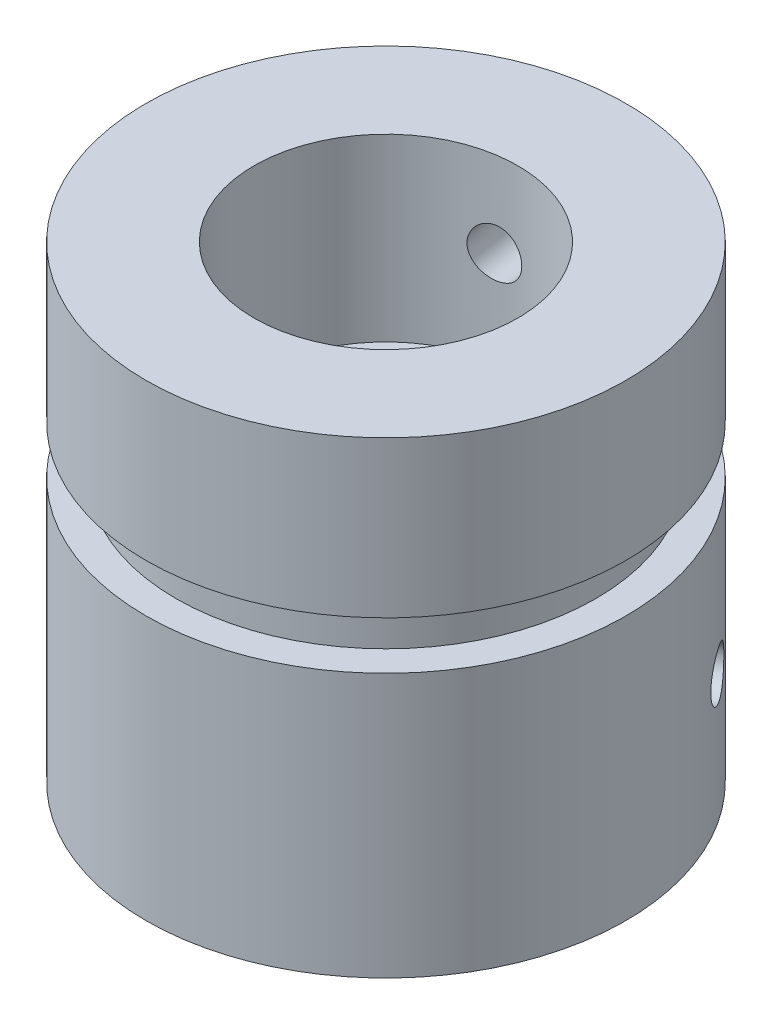
ISO-10303-21;
HEADER;
FILE_DESCRIPTION(('STEP AP214'),'2;1');
FILE_NAME('part.step','',(''),(''),'','','');
FILE_SCHEMA(('AUTOMOTIVE_DESIGN { 1 0 10303 214 1 1 1 1 }'));
ENDSEC;
DATA;
#1=APPLICATION_CONTEXT('core data for automotive mechanical design processes');
#2=APPLICATION_PROTOCOL_DEFINITION('international standard','automotive_design',2000,#1);
#3=PRODUCT_CONTEXT('',#1,'mechanical');
#4=PRODUCT('Part','Part','',(#3));
#5=PRODUCT_RELATED_PRODUCT_CATEGORY('part','',(#4));
#6=PRODUCT_DEFINITION_FORMATION('','',#4);
#7=PRODUCT_DEFINITION_CONTEXT('part definition',#1,'design');
#8=PRODUCT_DEFINITION('design','',#6,#7);
#9=PRODUCT_DEFINITION_SHAPE('','',#8);
#10=(LENGTH_UNIT() NAMED_UNIT(*) SI_UNIT(.MILLI.,.METRE.));
#11=(NAMED_UNIT(*) PLANE_ANGLE_UNIT() SI_UNIT($,.RADIAN.));
#12=(NAMED_UNIT(*) SI_UNIT($,.STERADIAN.) SOLID_ANGLE_UNIT());
#13=UNCERTAINTY_MEASURE_WITH_UNIT(LENGTH_MEASURE(1.E-05),#10,'distance_accuracy_value','');
#14=(GEOMETRIC_REPRESENTATION_CONTEXT(3) GLOBAL_UNCERTAINTY_ASSIGNED_CONTEXT((#13)) GLOBAL_UNIT_ASSIGNED_CONTEXT((#10,
#11,#12)) REPRESENTATION_CONTEXT('',''));
#15=CARTESIAN_POINT('',(0.,0.,0.));
#16=DIRECTION('',(0.,0.,1.));
#17=DIRECTION('',(1.,0.,0.));
#18=AXIS2_PLACEMENT_3D('',#15,#16,#17);
#19=CARTESIAN_POINT('',(0.,24.,0.));
#20=DIRECTION('',(0.,1.,0.));
#21=DIRECTION('',(0.,0.,1.));
#22=AXIS2_PLACEMENT_3D('',#19,#20,#21);
#23=PLANE('',#22);
#24=CARTESIAN_POINT('',(0.,24.,0.));
#25=DIRECTION('',(0.,1.,0.));
#26=DIRECTION('',(0.,0.,1.));
#27=AXIS2_PLACEMENT_3D('',#24,#25,#26);
#28=CIRCLE('',#27,4.);
#29=CARTESIAN_POINT('',(0.,24.,4.));
#30=VERTEX_POINT('',#29);
#31=EDGE_CURVE('E57',#30,#30,#28,.T.);
#32=ORIENTED_EDGE('',*,*,#31,.F.);
#33=EDGE_LOOP('',(#32));
#34=FACE_BOUND('',#33,.T.);
#35=CARTESIAN_POINT('',(0.,24.,0.));
#36=DIRECTION('',(0.,1.,0.));
#37=DIRECTION('',(0.,0.,1.));
#38=AXIS2_PLACEMENT_3D('',#35,#36,#37);
#39=CIRCLE('',#38,11.);
#40=CARTESIAN_POINT('',(0.,24.,11.));
#41=VERTEX_POINT('',#40);
#42=EDGE_CURVE('E10',#41,#41,#39,.F.);
#43=ORIENTED_EDGE('',*,*,#42,.F.);
#44=EDGE_LOOP('',(#43));
#45=FACE_BOUND('',#44,.T.);
#46=ADVANCED_FACE('F33',(#34,#45),#23,.T.);
#47=CARTESIAN_POINT('',(0.,22.,0.));
#48=DIRECTION('',(0.,1.,0.));
#49=DIRECTION('',(0.,0.,1.));
#50=AXIS2_PLACEMENT_3D('',#47,#48,#49);
#51=PLANE('',#50);
#52=CARTESIAN_POINT('',(0.,22.,0.));
#53=DIRECTION('',(0.,1.,0.));
#54=DIRECTION('',(0.,0.,1.));
#55=AXIS2_PLACEMENT_3D('',#52,#53,#54);
#56=CIRCLE('',#55,20.);
#57=CARTESIAN_POINT('',(0.,22.,20.));
#58=VERTEX_POINT('',#57);
#59=EDGE_CURVE('E41',#58,#58,#56,.T.);
#60=ORIENTED_EDGE('',*,*,#59,.T.);
#61=EDGE_LOOP('',(#60));
#62=FACE_BOUND('',#61,.T.);
#63=CARTESIAN_POINT('',(0.,22.,0.));
#64=DIRECTION('',(0.,1.,0.));
#65=DIRECTION('',(0.,0.,1.));
#66=AXIS2_PLACEMENT_3D('',#63,#64,#65);
#67=CIRCLE('',#66,17.5);
#68=CARTESIAN_POINT('',(0.,22.,17.5));
#69=VERTEX_POINT('',#68);
#70=EDGE_CURVE('E54',#69,#69,#67,.T.);
#71=ORIENTED_EDGE('',*,*,#70,.F.);
#72=EDGE_LOOP('',(#71));
#73=FACE_BOUND('',#72,.T.);
#74=ADVANCED_FACE('F126',(#62,#73),#51,.T.);
#75=CARTESIAN_POINT('',(0.,0.,0.));
#76=DIRECTION('',(0.,1.,0.));
#77=DIRECTION('',(0.,0.,1.));
#78=AXIS2_PLACEMENT_3D('',#75,#76,#77);
#79=PLANE('',#78);
#80=CARTESIAN_POINT('',(0.,0.,0.));
#81=DIRECTION('',(0.,1.,0.));
#82=DIRECTION('',(0.,0.,1.));
#83=AXIS2_PLACEMENT_3D('',#80,#81,#82);
#84=CIRCLE('',#83,20.);
#85=CARTESIAN_POINT('',(0.,0.,20.));
#86=VERTEX_POINT('',#85);
#87=EDGE_CURVE('E45',#86,#86,#84,.T.);
#88=ORIENTED_EDGE('',*,*,#87,.F.);
#89=EDGE_LOOP('',(#88));
#90=FACE_BOUND('',#89,.T.);
#91=CARTESIAN_POINT('',(0.,0.,0.));
#92=DIRECTION('',(0.,1.,0.));
#93=DIRECTION('',(0.,0.,1.));
#94=AXIS2_PLACEMENT_3D('',#91,#92,#93);
#95=CIRCLE('',#94,4.);
#96=CARTESIAN_POINT('',(0.,0.,4.));
#97=VERTEX_POINT('',#96);
#98=EDGE_CURVE('E50',#97,#97,#95,.T.);
#99=ORIENTED_EDGE('',*,*,#98,.T.);
#100=EDGE_LOOP('',(#99));
#101=FACE_BOUND('',#100,.T.);
#102=ADVANCED_FACE('F131',(#90,#101),#79,.F.);
#103=CARTESIAN_POINT('',(0.,22.,0.));
#104=DIRECTION('',(0.,-1.,0.));
#105=DIRECTION('',(0.,0.,-1.));
#106=AXIS2_PLACEMENT_3D('',#103,#104,#105);
#107=CYLINDRICAL_SURFACE('',#106,20.);
#108=CARTESIAN_POINT('',(15.3909682439954,10.5325818987797,-12.7717695137489));
#109=CARTESIAN_POINT('',(15.3909720440554,10.4205427704325,-12.7717662214388));
#110=CARTESIAN_POINT('',(15.3970367361014,10.3084295619561,-12.7644674356539));
#111=CARTESIAN_POINT('',(15.4210728520109,10.0873115261927,-12.735417299528));
#112=CARTESIAN_POINT('',(15.4390573975688,9.97831026270477,-12.7136500218069));
#113=CARTESIAN_POINT('',(15.486209502926,9.76665026034394,-12.6561719551576));
#114=CARTESIAN_POINT('',(15.5153702829427,9.66398771999687,-12.6204696193423));
#115=CARTESIAN_POINT('',(15.5837372149178,9.46784631419625,-12.5359512875308));
#116=CARTESIAN_POINT('',(15.6229413717032,9.37436562981231,-12.4871378960261));
#117=CARTESIAN_POINT('',(15.7100681150233,9.19887937146475,-12.3773451362583));
#118=CARTESIAN_POINT('',(15.7580184827791,9.11691187977218,-12.3163269395689));
#119=CARTESIAN_POINT('',(15.8608105723585,8.96710668077261,-12.1836659010681));
#120=CARTESIAN_POINT('',(15.9156526093087,8.89926961996713,-12.112022573388));
#121=CARTESIAN_POINT('',(16.0304290497222,8.77951938476544,-11.959700809368));
#122=CARTESIAN_POINT('',(16.090373890753,8.72763990119242,-11.8790037413824));
#123=CARTESIAN_POINT('',(16.2132334405108,8.64149303248239,-11.7107600003479));
#124=CARTESIAN_POINT('',(16.2761480768048,8.60722521804081,-11.6232134943218));
#125=CARTESIAN_POINT('',(16.4027076924813,8.55738608007325,-11.4439143240344));
#126=CARTESIAN_POINT('',(16.4663495020127,8.54175223327986,-11.3521768041806));
#127=CARTESIAN_POINT('',(16.5926434767783,8.52943136051232,-11.1667704009719));
#128=CARTESIAN_POINT('',(16.6552956676296,8.5327438432872,-11.0731015677559));
#129=CARTESIAN_POINT('',(16.7776222718003,8.55817084408006,-10.8868619609348));
#130=CARTESIAN_POINT('',(16.8373065262552,8.58021812990753,-10.7942884595369));
#131=CARTESIAN_POINT('',(16.9524009420536,8.64238415667299,-10.6126185848684));
#132=CARTESIAN_POINT('',(17.0078110478666,8.6825031323549,-10.5235222567812));
#133=CARTESIAN_POINT('',(17.1131573002131,8.77974742528863,-10.3513314926881));
#134=CARTESIAN_POINT('',(17.1630836596246,8.83690249384007,-10.2682478751817));
#135=CARTESIAN_POINT('',(17.2563034964411,8.96657494545249,-10.1108047967914));
#136=CARTESIAN_POINT('',(17.2995967792482,9.03909277907012,-10.0364455918752));
#137=CARTESIAN_POINT('',(17.3789075783219,9.19781035780704,-9.8984819417368));
#138=CARTESIAN_POINT('',(17.4148924256431,9.2840685882629,-9.83492598499151));
#139=CARTESIAN_POINT('',(17.4787269691803,9.4676156292013,-9.72102772585464));
#140=CARTESIAN_POINT('',(17.5065766535958,9.56490445568404,-9.67068544263021));
#141=CARTESIAN_POINT('',(17.5537023690329,9.76779594917933,-9.58488089182741));
#142=CARTESIAN_POINT('',(17.5729765923218,9.87340036362553,-9.54942176175102));
#143=CARTESIAN_POINT('',(17.6026510365328,10.0899031080091,-9.49461197421014));
#144=CARTESIAN_POINT('',(17.6130515278082,10.2008012765546,-9.47526082598913));
#145=CARTESIAN_POINT('',(17.6248017307765,10.4242302578388,-9.45338671427985));
#146=CARTESIAN_POINT('',(17.6261903775458,10.5367519393094,-9.45079135875285));
#147=CARTESIAN_POINT('',(17.6200005656033,10.7606844304255,-9.46232641761045));
#148=CARTESIAN_POINT('',(17.6124222280551,10.8720952550605,-9.47645660599626));
#149=CARTESIAN_POINT('',(17.5884334838443,11.0904050633364,-9.52090524200923));
#150=CARTESIAN_POINT('',(17.5720416808486,11.1973130409691,-9.55118958999953));
#151=CARTESIAN_POINT('',(17.5306792079806,11.4038620022404,-9.62689650367785));
#152=CARTESIAN_POINT('',(17.5057083415963,11.5035028193541,-9.672319416129));
#153=CARTESIAN_POINT('',(17.4474732529364,11.6930618468373,-9.77697610758962));
#154=CARTESIAN_POINT('',(17.4141810705344,11.7829457827123,-9.83625640385307));
#155=CARTESIAN_POINT('',(17.3399005886404,11.9500920053279,-9.96661732789417));
#156=CARTESIAN_POINT('',(17.2989120985876,12.0273539794599,-10.0376982478505));
#157=CARTESIAN_POINT('',(17.2098267151827,12.1673451655759,-10.1896828351251));
#158=CARTESIAN_POINT('',(17.161704744571,12.2300210179522,-10.2706209680223));
#159=CARTESIAN_POINT('',(17.0594479954067,12.3386936357926,-10.4395867844772));
#160=CARTESIAN_POINT('',(17.0053132992551,12.384690629794,-10.5276143708734));
#161=CARTESIAN_POINT('',(16.8923688031295,12.4586094340904,-10.7079018261933));
#162=CARTESIAN_POINT('',(16.8335675509829,12.4865634734302,-10.8001538317355));
#163=CARTESIAN_POINT('',(16.7126914471745,12.5237080379394,-10.9862755964545));
#164=CARTESIAN_POINT('',(16.6506166875659,12.5328990904478,-11.0801453100904));
#165=CARTESIAN_POINT('',(16.5251835775492,12.5322493658999,-11.2663594948866));
#166=CARTESIAN_POINT('',(16.4618320067146,12.5224914251064,-11.3587088328791));
#167=CARTESIAN_POINT('',(16.3354527443843,12.4843944074658,-11.5397215272106));
#168=CARTESIAN_POINT('',(16.272425053143,12.4560553160338,-11.6283848806564));
#169=CARTESIAN_POINT('',(16.1486754069908,12.3816233839939,-11.7996377621411));
#170=CARTESIAN_POINT('',(16.087953138829,12.3355329649114,-11.8822281167914));
#171=CARTESIAN_POINT('',(15.9707994212634,12.2269155609458,-12.0392347209294));
#172=CARTESIAN_POINT('',(15.9143679467552,12.1643886722375,-12.1136510182425));
#173=CARTESIAN_POINT('',(15.8075025711246,12.0243626607322,-12.2527793953078));
#174=CARTESIAN_POINT('',(15.7570948065452,11.9468018662901,-12.3174494823999));
#175=CARTESIAN_POINT('',(15.6643523223836,11.7790311956888,-12.435179879603));
#176=CARTESIAN_POINT('',(15.6220195430919,11.6888182884416,-12.4882373998493));
#177=CARTESIAN_POINT('',(15.5469267256583,11.4980532149399,-12.5816008241834));
#178=CARTESIAN_POINT('',(15.5141913079383,11.3974753361316,-12.6218739535638));
#179=CARTESIAN_POINT('',(15.4597393546928,11.1890853162873,-12.688511649414));
#180=CARTESIAN_POINT('',(15.438010391247,11.0812814909283,-12.7148919043431));
#181=CARTESIAN_POINT('',(15.411846131617,10.8994864169815,-12.7465778645495));
#182=CARTESIAN_POINT('',(15.4040310248944,10.8266573961669,-12.7560141114727));
#183=CARTESIAN_POINT('',(15.3935908409349,10.6800902526946,-12.768611006783));
#184=CARTESIAN_POINT('',(15.3909657419113,10.6063521338546,-12.7717716815138));
#185=CARTESIAN_POINT('',(15.3909682439954,10.5325818987797,-12.7717695137489));
#186=B_SPLINE_CURVE_WITH_KNOTS('',3,(#108,#109,#110,#111,#112,#113,#114,#115,#116,#117,#118,
#119,#120,#121,#122,#123,#124,#125,#126,#127,#128,#129,#130,#131,#132,#133,#134,#135,#136,#137,
#138,#139,#140,#141,#142,#143,#144,#145,#146,#147,#148,#149,#150,#151,#152,#153,#154,#155,#156,
#157,#158,#159,#160,#161,#162,#163,#164,#165,#166,#167,#168,#169,#170,#171,#172,#173,#174,#175,
#176,#177,#178,#179,#180,#181,#182,#183,#184,#185),.UNSPECIFIED.,.T.,.F.,(4,2,2,2,2,2,2,2,2,2,2,
2,2,2,2,2,2,2,2,2,2,2,2,2,2,2,2,2,2,2,2,2,2,2,2,2,2,2,4),(0.,0.335847988872925,
0.672066303643539,1.00808098199495,1.34402896084263,1.6810632305985,2.01811291710505,
2.35586939942583,2.69361764815589,3.03022941796899,3.36683245996464,3.70223263637322,
4.03763716961948,4.37363090932826,4.70963450437057,5.04710850170002,5.38458298855125,
5.72212858235866,6.05966389190065,6.39573992615529,6.73181141933739,7.06717629409053,
7.40254885122093,7.73906379623434,8.07558707446403,8.41332273636235,8.75105377036008,
9.08817985388721,9.42529646226297,9.76094266936964,10.0965891399331,10.4321898399049,
10.767788576216,11.1047943007597,11.4418809006905,11.7798248214095,12.11738629788,
12.3385205521209,12.5596538780763),.UNSPECIFIED.);
#187=CARTESIAN_POINT('',(15.3909682439954,10.5325818987797,-12.7717695137489));
#188=VERTEX_POINT('',#187);
#189=EDGE_CURVE('E72',#188,#188,#186,.T.);
#190=ORIENTED_EDGE('',*,*,#189,.T.);
#191=EDGE_LOOP('',(#190));
#192=FACE_BOUND('',#191,.T.);
#193=ORIENTED_EDGE('',*,*,#59,.F.);
#194=EDGE_LOOP('',(#193));
#195=FACE_BOUND('',#194,.T.);
#196=ORIENTED_EDGE('',*,*,#87,.T.);
#197=EDGE_LOOP('',(#196));
#198=FACE_BOUND('',#197,.T.);
#199=ADVANCED_FACE('F35',(#192,#195,#198),#107,.T.);
#200=CARTESIAN_POINT('',(0.,22.,0.));
#201=DIRECTION('',(0.,-1.,0.));
#202=DIRECTION('',(0.,0.,-1.));
#203=AXIS2_PLACEMENT_3D('',#200,#201,#202);
#204=CYLINDRICAL_SURFACE('',#203,4.);
#205=CARTESIAN_POINT('',(1.7567796359188,10.5325818987797,-3.59356721250918));
#206=CARTESIAN_POINT('',(1.75679283000752,10.4283686933054,-3.59356595339015));
#207=CARTESIAN_POINT('',(1.76531985553889,10.3240197222459,-3.58943096168029));
#208=CARTESIAN_POINT('',(1.79862617347518,10.1185267215491,-3.57285139835941));
#209=CARTESIAN_POINT('',(1.82343961618114,10.017389895532,-3.56038936513382));
#210=CARTESIAN_POINT('',(1.8869504065891,9.82167874233282,-3.52713531205447));
#211=CARTESIAN_POINT('',(1.92557389770552,9.7270726399305,-3.5063875368974));
#212=CARTESIAN_POINT('',(2.01399877991732,9.5457334483036,-3.45635381381173));
#213=CARTESIAN_POINT('',(2.06380077570492,9.45900078534298,-3.42706740396694));
#214=CARTESIAN_POINT('',(2.17632464995243,9.28797045564637,-3.35683727604843));
#215=CARTESIAN_POINT('',(2.23977335021337,9.20446363118798,-3.31513131113604));
#216=CARTESIAN_POINT('',(2.37334515638611,9.04976511820915,-3.22085657495544));
#217=CARTESIAN_POINT('',(2.44347156467837,8.97857957257578,-3.1682824137449));
#218=CARTESIAN_POINT('',(2.59212828728661,8.84584759759125,-3.04804858417364));
#219=CARTESIAN_POINT('',(2.67090644979579,8.78527436335644,-2.97961092628618));
#220=CARTESIAN_POINT('',(2.82860313721322,8.68230019199266,-2.8303283455945));
#221=CARTESIAN_POINT('',(2.90752154184393,8.63988778642895,-2.74949129685945));
#222=CARTESIAN_POINT('',(3.05609829547676,8.57757257624858,-2.58298523898507));
#223=CARTESIAN_POINT('',(3.12601597832476,8.55628284608765,-2.49806931913882));
#224=CARTESIAN_POINT('',(3.25961091031649,8.53224966141072,-2.32103529392694));
#225=CARTESIAN_POINT('',(3.32329191232474,8.52949498518347,-2.22892158051752));
#226=CARTESIAN_POINT('',(3.43693517314072,8.54207524672489,-2.04886039714592));
#227=CARTESIAN_POINT('',(3.4876088573941,8.55585792982339,-1.96124720701138));
#228=CARTESIAN_POINT('',(3.58084507161119,8.59834358658788,-1.78534578591609));
#229=CARTESIAN_POINT('',(3.62340699429546,8.62704767673188,-1.69705750492953));
#230=CARTESIAN_POINT('',(3.7006893652808,8.69874703095971,-1.52126729748173));
#231=CARTESIAN_POINT('',(3.7352931762089,8.74193452512397,-1.43379315065212));
#232=CARTESIAN_POINT('',(3.79632361836388,8.84110873118265,-1.26338101295286));
#233=CARTESIAN_POINT('',(3.82274731404949,8.89710002538443,-1.18044465929919));
#234=CARTESIAN_POINT('',(3.87044186043689,9.02637260184581,-1.01384366327234));
#235=CARTESIAN_POINT('',(3.89098951909004,9.10078795543178,-0.930851249505833));
#236=CARTESIAN_POINT('',(3.9248517512014,9.2617613486401,-0.775790268096948));
#237=CARTESIAN_POINT('',(3.93816077361105,9.34832864332787,-0.703730114457341));
#238=CARTESIAN_POINT('',(3.95989152358749,9.53787828362793,-0.569371600112251));
#239=CARTESIAN_POINT('',(3.96794921727975,9.64155394488817,-0.507983750695575));
#240=CARTESIAN_POINT('',(3.97980498733877,9.85845724149775,-0.404815813618186));
#241=CARTESIAN_POINT('',(3.98360751359104,9.97167476481487,-0.363015268979284));
#242=CARTESIAN_POINT('',(3.98846229202149,10.1950109213453,-0.304896954869585));
#243=CARTESIAN_POINT('',(3.98970861201341,10.3046641368668,-0.286822288964343));
#244=CARTESIAN_POINT('',(3.99075844484332,10.5253845818128,-0.271877571616975));
#245=CARTESIAN_POINT('',(3.99056297684754,10.6364507570193,-0.274992541595269));
#246=CARTESIAN_POINT('',(3.98870503184918,10.8438897359372,-0.300586049638195));
#247=CARTESIAN_POINT('',(3.98720537147342,10.9405408009955,-0.320909112702919));
#248=CARTESIAN_POINT('',(3.98232303936164,11.1293174713217,-0.376670210613729));
#249=CARTESIAN_POINT('',(3.97893975771962,11.2214416002732,-0.412113140318359));
#250=CARTESIAN_POINT('',(3.96911286457871,11.4034045605849,-0.498085938542994));
#251=CARTESIAN_POINT('',(3.96253477071397,11.4929399324858,-0.549238533301799));
#252=CARTESIAN_POINT('',(3.94500301391803,11.6635204418588,-0.663545941842856));
#253=CARTESIAN_POINT('',(3.9340471006864,11.7445611858103,-0.726706919445627));
#254=CARTESIAN_POINT('',(3.9047165932706,11.9065394338224,-0.871372560357581));
#255=CARTESIAN_POINT('',(3.88558092579545,11.9861762001975,-0.954185917386525));
#256=CARTESIAN_POINT('',(3.83839268652889,12.1314063747845,-1.12913634310326));
#257=CARTESIAN_POINT('',(3.81033711062939,12.1969950393066,-1.2212765458139));
#258=CARTESIAN_POINT('',(3.74307560061328,12.3137293506125,-1.41424288728613));
#259=CARTESIAN_POINT('',(3.70359492943881,12.3644481349465,-1.51523408558475));
#260=CARTESIAN_POINT('',(3.61314083432289,12.4468577067494,-1.7197895369481));
#261=CARTESIAN_POINT('',(3.56217755633909,12.4785652024638,-1.82335144709799));
#262=CARTESIAN_POINT('',(3.45450223495221,12.5193190262649,-2.01934523965697));
#263=CARTESIAN_POINT('',(3.39874669465457,12.530177647444,-2.11192648967358));
#264=CARTESIAN_POINT('',(3.27966738878581,12.5342684327754,-2.29247873024106));
#265=CARTESIAN_POINT('',(3.21634627998193,12.5275067673086,-2.3804513236739));
#266=CARTESIAN_POINT('',(3.08879206841373,12.4977490744633,-2.5434980028843));
#267=CARTESIAN_POINT('',(3.02489400640891,12.4758521614707,-2.61904004484648));
#268=CARTESIAN_POINT('',(2.89473174963625,12.4179279389731,-2.76222661929293));
#269=CARTESIAN_POINT('',(2.82846721678807,12.3818986030728,-2.82987001741442));
#270=CARTESIAN_POINT('',(2.69307699738843,12.2951276437883,-2.95913381305014));
#271=CARTESIAN_POINT('',(2.62395015625195,12.2438226790279,-3.02037286419849));
#272=CARTESIAN_POINT('',(2.48825445740932,12.1286666106617,-3.13311102718751));
#273=CARTESIAN_POINT('',(2.42168679142436,12.0648097446782,-3.18460564412259));
#274=CARTESIAN_POINT('',(2.28729782026869,11.9189852632203,-3.28266006753445));
#275=CARTESIAN_POINT('',(2.22001105684953,11.8358477179795,-3.32821874405798));
#276=CARTESIAN_POINT('',(2.09510341988577,11.6576896704737,-3.40823336884813));
#277=CARTESIAN_POINT('',(2.03749111124136,11.5626587674192,-3.44267950364957));
#278=CARTESIAN_POINT('',(1.93412528282244,11.3592730046495,-3.5018340275786));
#279=CARTESIAN_POINT('',(1.88880405960264,11.2505919880445,-3.52620028474973));
#280=CARTESIAN_POINT('',(1.83479822602958,11.0820037791488,-3.55442239752045));
#281=CARTESIAN_POINT('',(1.81913348903191,11.0249340781891,-3.56243839020892));
#282=CARTESIAN_POINT('',(1.7928366822121,10.9093493412796,-3.57574565623739));
#283=CARTESIAN_POINT('',(1.78220109392315,10.8508353460255,-3.5810388347269));
#284=CARTESIAN_POINT('',(1.76845618150436,10.7489811095325,-3.58784108783401));
#285=CARTESIAN_POINT('',(1.76408593814497,10.7058488415297,-3.58998816020092));
#286=CARTESIAN_POINT('',(1.75824482139097,10.6193462056868,-3.5928515325421));
#287=CARTESIAN_POINT('',(1.75677414195791,10.575975822113,-3.59356773680084));
#288=CARTESIAN_POINT('',(1.7567796359188,10.5325818987797,-3.59356721250918));
#289=B_SPLINE_CURVE_WITH_KNOTS('',3,(#205,#206,#207,#208,#209,#210,#211,#212,#213,#214,#215,
#216,#217,#218,#219,#220,#221,#222,#223,#224,#225,#226,#227,#228,#229,#230,#231,#232,#233,#234,
#235,#236,#237,#238,#239,#240,#241,#242,#243,#244,#245,#246,#247,#248,#249,#250,#251,#252,#253,
#254,#255,#256,#257,#258,#259,#260,#261,#262,#263,#264,#265,#266,#267,#268,#269,#270,#271,#272,
#273,#274,#275,#276,#277,#278,#279,#280,#281,#282,#283,#284,#285,#286,#287,#288),.UNSPECIFIED.,
.T.,.F.,(4,2,2,2,2,2,2,2,2,2,2,2,2,2,2,2,2,2,2,2,2,2,2,2,2,2,2,2,2,2,2,2,2,2,2,2,2,2,2,2,2,4),
(0.,0.31246424518943,0.625585785649607,0.937057191861533,1.24854545093096,1.58572462503713,
1.92307142172808,2.28315784481593,2.64301653931848,2.97726969939936,3.31132047376146,
3.61632194973143,3.92134625038976,4.23059069466359,4.5399459870461,4.87854382917847,
5.21740096495903,5.57777683462963,5.93777548427475,6.26924581712489,6.60048186380812,
6.89548366852116,7.19058104876191,7.4993459281624,7.8082697244416,8.15613487165291,
8.50411729960469,8.86128362829997,9.21813559621608,9.54224540783039,9.86624173592008,
10.1688884974705,10.4715786702809,10.7872150144301,11.102996602055,11.450204837042,
11.7977188569437,12.1562149808127,12.3351395323571,12.5139387197526,12.6440387634035,
12.7741475095882),.UNSPECIFIED.);
#290=CARTESIAN_POINT('',(1.7567796359188,10.5325818987797,-3.59356721250918));
#291=VERTEX_POINT('',#290);
#292=EDGE_CURVE('E78',#291,#291,#289,.T.);
#293=ORIENTED_EDGE('',*,*,#292,.F.);
#294=EDGE_LOOP('',(#293));
#295=FACE_BOUND('',#294,.T.);
#296=ORIENTED_EDGE('',*,*,#98,.F.);
#297=EDGE_LOOP('',(#296));
#298=FACE_BOUND('',#297,.T.);
#299=ORIENTED_EDGE('',*,*,#31,.T.);
#300=EDGE_LOOP('',(#299));
#301=FACE_BOUND('',#300,.T.);
#302=ADVANCED_FACE('F139',(#295,#298,#301),#204,.F.);
#303=CARTESIAN_POINT('',(0.,24.,0.));
#304=DIRECTION('',(0.,-1.,0.));
#305=DIRECTION('',(0.,0.,-1.));
#306=AXIS2_PLACEMENT_3D('',#303,#304,#305);
#307=CYLINDRICAL_SURFACE('',#306,17.5);
#308=ORIENTED_EDGE('',*,*,#70,.T.);
#309=EDGE_LOOP('',(#308));
#310=FACE_BOUND('',#309,.T.);
#311=CARTESIAN_POINT('',(0.,26.,0.));
#312=DIRECTION('',(0.,1.,0.));
#313=DIRECTION('',(0.,0.,1.));
#314=AXIS2_PLACEMENT_3D('',#311,#312,#313);
#315=CIRCLE('',#314,17.5);
#316=CARTESIAN_POINT('',(0.,26.,17.5));
#317=VERTEX_POINT('',#316);
#318=EDGE_CURVE('E60',#317,#317,#315,.T.);
#319=ORIENTED_EDGE('',*,*,#318,.F.);
#320=EDGE_LOOP('',(#319));
#321=FACE_BOUND('',#320,.T.);
#322=ADVANCED_FACE('F136',(#310,#321),#307,.T.);
#323=CARTESIAN_POINT('',(0.,26.,0.));
#324=DIRECTION('',(0.,-1.,0.));
#325=DIRECTION('',(0.,0.,-1.));
#326=AXIS2_PLACEMENT_3D('',#323,#324,#325);
#327=CYLINDRICAL_SURFACE('',#326,11.);
#328=CARTESIAN_POINT('',(0.,33.0052977643437,-11.));
#329=CARTESIAN_POINT('',(-0.0619843796610766,33.0999075489431,-10.9999998056723));
#330=CARTESIAN_POINT('',(-0.131997854040876,33.1893296594738,-10.9994780051467));
#331=CARTESIAN_POINT('',(-0.285987710406074,33.3552875206885,-10.9965509111825));
#332=CARTESIAN_POINT('',(-0.369977583170451,33.4318106755328,-10.9941437895266));
#333=CARTESIAN_POINT('',(-0.549435588747544,33.5697697268016,-10.9866359833633));
#334=CARTESIAN_POINT('',(-0.644901815101461,33.6312081239703,-10.9815357457617));
#335=CARTESIAN_POINT('',(-0.844537597343971,33.7372193742717,-10.9679874892666));
#336=CARTESIAN_POINT('',(-0.948704846545328,33.7817966801538,-10.9595403554441));
#337=CARTESIAN_POINT('',(-1.16210143836329,33.8525539615347,-10.9389640983513));
#338=CARTESIAN_POINT('',(-1.2712981729161,33.8788384106565,-10.926856460208));
#339=CARTESIAN_POINT('',(-1.4920949441817,33.9125960030431,-10.8989003074775));
#340=CARTESIAN_POINT('',(-1.60369483813616,33.9200702606246,-10.8830520145479));
#341=CARTESIAN_POINT('',(-1.82444232651318,33.9159997547684,-10.8482129726815));
#342=CARTESIAN_POINT('',(-1.93360236395191,33.9047202272774,-10.8292694072643));
#343=CARTESIAN_POINT('',(-2.14797936818832,33.8639984295778,-10.7887945801647));
#344=CARTESIAN_POINT('',(-2.2531963321057,33.8345561461022,-10.7672633165921));
#345=CARTESIAN_POINT('',(-2.45685194010249,33.7583882987048,-10.7226283834938));
#346=CARTESIAN_POINT('',(-2.55528835448674,33.7116570814226,-10.6995242016536));
#347=CARTESIAN_POINT('',(-2.74278722770334,33.6022601513961,-10.6530024668866));
#348=CARTESIAN_POINT('',(-2.83184884478811,33.5395930095141,-10.6295848860328));
#349=CARTESIAN_POINT('',(-2.99953444153998,33.3990559514407,-10.5835000098408));
#350=CARTESIAN_POINT('',(-3.07799294673343,33.3209835154292,-10.5608480142917));
#351=CARTESIAN_POINT('',(-3.22096073402416,33.1523506476942,-10.5181268785925));
#352=CARTESIAN_POINT('',(-3.28546931167158,33.0617895856923,-10.4980578689));
#353=CARTESIAN_POINT('',(-3.39923356413116,32.8700042000372,-10.4617786713844));
#354=CARTESIAN_POINT('',(-3.448386049312,32.7687136139492,-10.4455947518574));
#355=CARTESIAN_POINT('',(-3.529500268832,32.5588113977068,-10.4184677133026));
#356=CARTESIAN_POINT('',(-3.56146351514666,32.450200412405,-10.4075241333407));
#357=CARTESIAN_POINT('',(-3.60701741082855,32.2300706738707,-10.391823960983));
#358=CARTESIAN_POINT('',(-3.62081562832377,32.1185998803081,-10.3869974937601));
#359=CARTESIAN_POINT('',(-3.6303153460294,31.8948005447842,-10.3836813499982));
#360=CARTESIAN_POINT('',(-3.62601824831373,31.7824720699514,-10.3851911825054));
#361=CARTESIAN_POINT('',(-3.59961545539416,31.5615404848336,-10.3943713191953));
#362=CARTESIAN_POINT('',(-3.57772027576407,31.4529090693312,-10.4019687971483));
#363=CARTESIAN_POINT('',(-3.51700411089502,31.2410354753644,-10.4226533098015));
#364=CARTESIAN_POINT('',(-3.47818237428646,31.1377935363665,-10.4357405881929));
#365=CARTESIAN_POINT('',(-3.38435336524977,30.9388607250158,-10.4665464438965));
#366=CARTESIAN_POINT('',(-3.32924210200003,30.8432235377263,-10.4842946926404));
#367=CARTESIAN_POINT('',(-3.20436240297845,30.6628103784893,-10.5231328551851));
#368=CARTESIAN_POINT('',(-3.13459257174028,30.5780354418441,-10.5442230870889));
#369=CARTESIAN_POINT('',(-2.9810316219571,30.4204582855518,-10.5886693237167));
#370=CARTESIAN_POINT('',(-2.89705043066375,30.3478492204872,-10.6120539453549));
#371=CARTESIAN_POINT('',(-2.71796692924384,30.2181633211215,-10.6593254187559));
#372=CARTESIAN_POINT('',(-2.62286459599191,30.1610865191189,-10.6832122715629));
#373=CARTESIAN_POINT('',(-2.42402992825547,30.0641151924122,-10.7300746236513));
#374=CARTESIAN_POINT('',(-2.32029593121001,30.0242239870411,-10.7530499460967));
#375=CARTESIAN_POINT('',(-2.1070853752187,29.9628682414253,-10.7968524845808));
#376=CARTESIAN_POINT('',(-1.99760939645081,29.9414018433034,-10.8176799170171));
#377=CARTESIAN_POINT('',(-1.77763608364556,29.917744098844,-10.8559797669793));
#378=CARTESIAN_POINT('',(-1.66717510544968,29.9152843805913,-10.8734954771767));
#379=CARTESIAN_POINT('',(-1.44691391725913,29.9290102892562,-10.9049904563938));
#380=CARTESIAN_POINT('',(-1.33711368002874,29.9451951422794,-10.9189698721676));
#381=CARTESIAN_POINT('',(-1.12205532399767,29.9955362035767,-10.9431546400628));
#382=CARTESIAN_POINT('',(-1.01677229882266,30.0295747877357,-10.9533839579596));
#383=CARTESIAN_POINT('',(-0.812959266584012,30.1145381516674,-10.9703949681832));
#384=CARTESIAN_POINT('',(-0.714429733165911,30.1654641143505,-10.977176418913));
#385=CARTESIAN_POINT('',(-0.525837252571761,30.2834033357867,-10.9878352840241));
#386=CARTESIAN_POINT('',(-0.435878847248835,30.350586670769,-10.9916800806941));
#387=CARTESIAN_POINT('',(-0.268201532586325,30.498883543616,-10.9970504607633));
#388=CARTESIAN_POINT('',(-0.190483666326525,30.5799982674167,-10.9985758466092));
#389=CARTESIAN_POINT('',(-0.0486788478091296,30.7550204291405,-11.0001241678187));
#390=CARTESIAN_POINT('',(0.015233948595548,30.849069274416,-11.0001289143661));
#391=CARTESIAN_POINT('',(0.126269372159048,31.0466027384203,-10.9994160087944));
#392=CARTESIAN_POINT('',(0.173393131748717,31.1500867201518,-10.9986984054106));
#393=CARTESIAN_POINT('',(0.249115429067479,31.36297117051,-10.9972440941778));
#394=CARTESIAN_POINT('',(0.277817152631714,31.4723348986023,-10.9965075172109));
#395=CARTESIAN_POINT('',(0.316147095003707,31.6943751127123,-10.9954729868035));
#396=CARTESIAN_POINT('',(0.325774061553773,31.807051815734,-10.9951750621609));
#397=CARTESIAN_POINT('',(0.325622215874754,32.0307488229076,-10.9951792548458));
#398=CARTESIAN_POINT('',(0.316121895391143,32.141769527451,-10.9954727610415));
#399=CARTESIAN_POINT('',(0.278593902963338,32.3605622042012,-10.99648743177));
#400=CARTESIAN_POINT('',(0.250581786567643,32.4683368246736,-10.9972082371888));
#401=CARTESIAN_POINT('',(0.187076471836845,32.6490056800971,-10.9984406761683));
#402=CARTESIAN_POINT('',(0.155718670905891,32.7233842951749,-10.9989556494236));
#403=CARTESIAN_POINT('',(0.0842665150127612,32.8678194169555,-10.9997353825907));
#404=CARTESIAN_POINT('',(0.0441720197525977,32.9378758542276,-11.0000001384841));
#405=CARTESIAN_POINT('',(0.,33.0052977643437,-11.));
#406=B_SPLINE_CURVE_WITH_KNOTS('',3,(#328,#329,#330,#331,#332,#333,#334,#335,#336,#337,#338,
#339,#340,#341,#342,#343,#344,#345,#346,#347,#348,#349,#350,#351,#352,#353,#354,#355,#356,#357,
#358,#359,#360,#361,#362,#363,#364,#365,#366,#367,#368,#369,#370,#371,#372,#373,#374,#375,#376,
#377,#378,#379,#380,#381,#382,#383,#384,#385,#386,#387,#388,#389,#390,#391,#392,#393,#394,#395,
#396,#397,#398,#399,#400,#401,#402,#403,#404,#405),.UNSPECIFIED.,.T.,.F.,(4,2,2,2,2,2,2,2,2,2,2,
2,2,2,2,2,2,2,2,2,2,2,2,2,2,2,2,2,2,2,2,2,2,2,2,2,2,2,4),(0.,0.339027417031874,
0.678384000440657,1.01768428742893,1.35689490787492,1.69415197923397,2.03138907099627,
2.36389705140056,2.69640527468672,3.02902232207165,3.36166920916351,3.69902176007947,
4.03639134280342,4.3759814991934,4.7155417801469,5.05118729096377,5.386806795538,
5.71847019138583,6.05014831126572,6.38399133024832,6.7178661448302,7.05662205422568,
7.39537866804494,7.73420068212082,8.0729885268462,8.40698383046752,8.74096527119191,
9.07277350895746,9.40460499381197,9.74007062048393,10.075564818472,10.4150718136897,
10.7545559046146,11.0921214832591,11.4297092223478,11.7624172588157,12.0948460740593,
12.3364438015144,12.5780454089466),.UNSPECIFIED.);
#407=CARTESIAN_POINT('',(0.,33.0052977643437,-11.));
#408=VERTEX_POINT('',#407);
#409=EDGE_CURVE('E114',#408,#408,#406,.T.);
#410=ORIENTED_EDGE('',*,*,#409,.F.);
#411=EDGE_LOOP('',(#410));
#412=FACE_BOUND('',#411,.T.);
#413=ORIENTED_EDGE('',*,*,#42,.T.);
#414=EDGE_LOOP('',(#413));
#415=FACE_BOUND('',#414,.T.);
#416=CARTESIAN_POINT('',(0.,39.,0.));
#417=DIRECTION('',(0.,1.,0.));
#418=DIRECTION('',(0.,0.,1.));
#419=AXIS2_PLACEMENT_3D('',#416,#417,#418);
#420=CIRCLE('',#419,11.);
#421=CARTESIAN_POINT('',(0.,39.,11.));
#422=VERTEX_POINT('',#421);
#423=EDGE_CURVE('E67',#422,#422,#420,.T.);
#424=ORIENTED_EDGE('',*,*,#423,.T.);
#425=EDGE_LOOP('',(#424));
#426=FACE_BOUND('',#425,.T.);
#427=ADVANCED_FACE('F102',(#412,#415,#426),#327,.F.);
#428=CARTESIAN_POINT('',(0.,26.,0.));
#429=DIRECTION('',(0.,1.,0.));
#430=DIRECTION('',(0.,0.,1.));
#431=AXIS2_PLACEMENT_3D('',#428,#429,#430);
#432=PLANE('',#431);
#433=CARTESIAN_POINT('',(0.,26.,0.));
#434=DIRECTION('',(0.,1.,0.));
#435=DIRECTION('',(0.,0.,1.));
#436=AXIS2_PLACEMENT_3D('',#433,#434,#435);
#437=CIRCLE('',#436,20.);
#438=CARTESIAN_POINT('',(0.,26.,20.));
#439=VERTEX_POINT('',#438);
#440=EDGE_CURVE('E64',#439,#439,#437,.T.);
#441=ORIENTED_EDGE('',*,*,#440,.F.);
#442=EDGE_LOOP('',(#441));
#443=FACE_BOUND('',#442,.T.);
#444=ORIENTED_EDGE('',*,*,#318,.T.);
#445=EDGE_LOOP('',(#444));
#446=FACE_BOUND('',#445,.T.);
#447=ADVANCED_FACE('F98',(#443,#446),#432,.F.);
#448=CARTESIAN_POINT('',(0.,39.,0.));
#449=DIRECTION('',(0.,1.,0.));
#450=DIRECTION('',(0.,0.,1.));
#451=AXIS2_PLACEMENT_3D('',#448,#449,#450);
#452=PLANE('',#451);
#453=CARTESIAN_POINT('',(0.,39.,0.));
#454=DIRECTION('',(0.,1.,0.));
#455=DIRECTION('',(0.,0.,1.));
#456=AXIS2_PLACEMENT_3D('',#453,#454,#455);
#457=CIRCLE('',#456,20.);
#458=CARTESIAN_POINT('',(0.,39.,20.));
#459=VERTEX_POINT('',#458);
#460=EDGE_CURVE('E63',#459,#459,#457,.T.);
#461=ORIENTED_EDGE('',*,*,#460,.T.);
#462=EDGE_LOOP('',(#461));
#463=FACE_BOUND('',#462,.T.);
#464=ORIENTED_EDGE('',*,*,#423,.F.);
#465=EDGE_LOOP('',(#464));
#466=FACE_BOUND('',#465,.T.);
#467=ADVANCED_FACE('F95',(#463,#466),#452,.T.);
#468=CARTESIAN_POINT('',(0.,39.,0.));
#469=DIRECTION('',(0.,-1.,0.));
#470=DIRECTION('',(0.,0.,-1.));
#471=AXIS2_PLACEMENT_3D('',#468,#469,#470);
#472=CYLINDRICAL_SURFACE('',#471,20.);
#473=CARTESIAN_POINT('',(-5.01372964317494,31.9183524540549,-19.361366559857));
#474=CARTESIAN_POINT('',(-5.01372504733697,31.8063133257077,-19.361368598983));
#475=CARTESIAN_POINT('',(-5.00453999767249,31.6942001172312,-19.3637534734467));
#476=CARTESIAN_POINT('',(-4.96802572918005,31.4730820814678,-19.3731531262814));
#477=CARTESIAN_POINT('',(-4.94067651468351,31.3640808179799,-19.3801730069592));
#478=CARTESIAN_POINT('',(-4.8686024248122,31.1524208156191,-19.3984041548821));
#479=CARTESIAN_POINT('',(-4.82388808333862,31.049758275272,-19.4096128809666));
#480=CARTESIAN_POINT('',(-4.7183186239376,30.8536168694714,-19.4355450047063));
#481=CARTESIAN_POINT('',(-4.65746671174451,30.7601361850875,-19.4502677042513));
#482=CARTESIAN_POINT('',(-4.52104414664492,30.5846499267399,-19.4824298439598));
#483=CARTESIAN_POINT('',(-4.44542653679586,30.5026824350473,-19.4998779147949));
#484=CARTESIAN_POINT('',(-4.28164459765476,30.3528772360478,-19.5364926826814));
#485=CARTESIAN_POINT('',(-4.1934796946041,30.2850401752423,-19.5556594583103));
#486=CARTESIAN_POINT('',(-4.00680687326347,30.1652899400406,-19.5947594434876));
#487=CARTESIAN_POINT('',(-3.90827765329009,30.1134104564676,-19.6146941759691));
#488=CARTESIAN_POINT('',(-3.70375687236628,30.0272635877575,-19.6543385391787));
#489=CARTESIAN_POINT('',(-3.59776549338612,29.992995773316,-19.6740481753822));
#490=CARTESIAN_POINT('',(-3.38166530419452,29.9431566353484,-19.7123396498547));
#491=CARTESIAN_POINT('',(-3.27157154867495,29.927522788555,-19.7309250598575));
#492=CARTESIAN_POINT('',(-3.05005691376468,29.9152019157875,-19.7663788175349));
#493=CARTESIAN_POINT('',(-2.93863606885824,29.9185143985624,-19.7832472097178));
#494=CARTESIAN_POINT('',(-2.71805458477998,29.9439413993552,-19.8147559088124));
#495=CARTESIAN_POINT('',(-2.60888729153269,29.9659886851827,-19.8294039624707));
#496=CARTESIAN_POINT('',(-2.39551741231279,30.0281547119482,-19.8563105146787));
#497=CARTESIAN_POINT('',(-2.29131489084999,30.0682736876301,-19.8685689821857));
#498=CARTESIAN_POINT('',(-2.09066990180065,30.1655179805638,-19.8906841464807));
#499=CARTESIAN_POINT('',(-1.99424138790117,30.2226730491152,-19.9005365862388));
#500=CARTESIAN_POINT('',(-1.81210109814392,30.3523455007277,-19.9179485291586));
#501=CARTESIAN_POINT('',(-1.72638963671138,30.4248633343453,-19.9255079650558));
#502=CARTESIAN_POINT('',(-1.56779467857106,30.5835809130822,-19.9386156292905));
#503=CARTESIAN_POINT('',(-1.4949689604009,30.6698391435381,-19.9441549115128));
#504=CARTESIAN_POINT('',(-1.36473641900036,30.8533861844765,-19.9534901963701));
#505=CARTESIAN_POINT('',(-1.30732961813596,30.9506750109592,-19.9572861964764));
#506=CARTESIAN_POINT('',(-1.20962955695366,31.1535665044545,-19.9634467190927));
#507=CARTESIAN_POINT('',(-1.16933990506224,31.2591709189007,-19.9658109398172));
#508=CARTESIAN_POINT('',(-1.10711370322608,31.4756736632843,-19.9693585100497));
#509=CARTESIAN_POINT('',(-1.08517659414043,31.5865718318298,-19.970541895534));
#510=CARTESIAN_POINT('',(-1.06038204139575,31.8100008131139,-19.9718738816664));
#511=CARTESIAN_POINT('',(-1.05744252014682,31.9225224945846,-19.9720269339081));
#512=CARTESIAN_POINT('',(-1.07051486634074,32.1464549857006,-19.9713304285472));
#513=CARTESIAN_POINT('',(-1.08652647771222,32.2578658103357,-19.9704808844917));
#514=CARTESIAN_POINT('',(-1.13695718071096,32.4761756186116,-19.9676728091223));
#515=CARTESIAN_POINT('',(-1.17133749828601,32.5830835962442,-19.9657166133025));
#516=CARTESIAN_POINT('',(-1.25744757977485,32.7896325575155,-19.9604778342044));
#517=CARTESIAN_POINT('',(-1.30917774110336,32.8892733746293,-19.9571952205429));
#518=CARTESIAN_POINT('',(-1.42866475377246,33.0788324021125,-19.9489975121969));
#519=CARTESIAN_POINT('',(-1.49647559699827,33.1687163379874,-19.94407689484));
#520=CARTESIAN_POINT('',(-1.64605032187015,33.335862560603,-19.9322886724652));
#521=CARTESIAN_POINT('',(-1.72781454899773,33.4131245347351,-19.9254210192365));
#522=CARTESIAN_POINT('',(-1.9032562634613,33.5531157208511,-19.9094296111831));
#523=CARTESIAN_POINT('',(-1.99697560915106,33.6157915732273,-19.9002978174967));
#524=CARTESIAN_POINT('',(-2.19338791428539,33.7244641910677,-19.8796073300275));
#525=CARTESIAN_POINT('',(-2.29608075074937,33.7704611850691,-19.8680486695015));
#526=CARTESIAN_POINT('',(-2.50728513430004,33.8443799893656,-19.842500007702));
#527=CARTESIAN_POINT('',(-2.61578592931116,33.8723340287053,-19.8285143985794));
#528=CARTESIAN_POINT('',(-2.83564388756457,33.9094785932146,-19.7982683745986));
#529=CARTESIAN_POINT('',(-2.94700097044104,33.918669645723,-19.7820080236862));
#530=CARTESIAN_POINT('',(-3.16888058672629,33.918019921175,-19.7476769359536));
#531=CARTESIAN_POINT('',(-3.2794046416849,33.9082619803816,-19.729614404836));
#532=CARTESIAN_POINT('',(-3.49697897355155,33.870164962741,-19.6922148918835));
#533=CARTESIAN_POINT('',(-3.60402924773286,33.841825871309,-19.6728779090483));
#534=CARTESIAN_POINT('',(-3.81165202603092,33.767393939269,-19.6337076873052));
#535=CARTESIAN_POINT('',(-3.91222541150123,33.7213035201866,-19.6138745164292));
#536=CARTESIAN_POINT('',(-4.10414931158693,33.6126861162209,-19.574615328227));
#537=CARTESIAN_POINT('',(-4.19549988016357,33.5501592275127,-19.5551893085192));
#538=CARTESIAN_POINT('',(-4.36686744965125,33.4101332160074,-19.5176384105088));
#539=CARTESIAN_POINT('',(-4.44683532924718,33.3325724215653,-19.4995193286524));
#540=CARTESIAN_POINT('',(-4.59283021287014,33.164801750964,-19.4656503347203));
#541=CARTESIAN_POINT('',(-4.65885386672922,33.0745888437168,-19.4499009922468));
#542=CARTESIAN_POINT('',(-4.77528907121584,32.8838237702151,-19.4216431899674));
#543=CARTESIAN_POINT('',(-4.82566048811624,32.7832458914068,-19.4091430746541));
#544=CARTESIAN_POINT('',(-4.90912909376474,32.5748558715624,-19.3882005439675));
#545=CARTESIAN_POINT('',(-4.94224576689421,32.4670520462035,-19.3797535525867));
#546=CARTESIAN_POINT('',(-4.98205067780645,32.2852569722567,-19.3695487682452));
#547=CARTESIAN_POINT('',(-4.99391467973323,32.212427951442,-19.3664886853437));
#548=CARTESIAN_POINT('',(-5.00975565888855,32.0658608079698,-19.3623969140933));
#549=CARTESIAN_POINT('',(-5.01373266922534,31.9921226891297,-19.3613652172296));
#550=CARTESIAN_POINT('',(-5.01372964317494,31.9183524540549,-19.361366559857));
#551=B_SPLINE_CURVE_WITH_KNOTS('',3,(#473,#474,#475,#476,#477,#478,#479,#480,#481,#482,#483,
#484,#485,#486,#487,#488,#489,#490,#491,#492,#493,#494,#495,#496,#497,#498,#499,#500,#501,#502,
#503,#504,#505,#506,#507,#508,#509,#510,#511,#512,#513,#514,#515,#516,#517,#518,#519,#520,#521,
#522,#523,#524,#525,#526,#527,#528,#529,#530,#531,#532,#533,#534,#535,#536,#537,#538,#539,#540,
#541,#542,#543,#544,#545,#546,#547,#548,#549,#550),.UNSPECIFIED.,.T.,.F.,(4,2,2,2,2,2,2,2,2,2,2,
2,2,2,2,2,2,2,2,2,2,2,2,2,2,2,2,2,2,2,2,2,2,2,2,2,2,2,4),(0.,0.335847988872927,
0.672066303643539,1.00808098199495,1.34402896084263,1.6810632305985,2.01811291710505,
2.35586939942583,2.69361764815589,3.03022941796898,3.36683245996464,3.70223263637322,
4.03763716961947,4.37363090932825,4.70963450437056,5.0471085017,5.38458298855124,
5.72212858235865,6.05966389190063,6.39573992615528,6.73181141933738,7.06717629409052,
7.40254885122091,7.73906379623433,8.07558707446402,8.41332273636233,8.75105377036006,
9.08817985388719,9.42529646226295,9.76094266936962,10.0965891399331,10.4321898399049,
10.7677885762159,11.1047943007597,11.4418809006904,11.7798248214095,12.11738629788,
12.3385205521209,12.5596538780762),.UNSPECIFIED.);
#552=CARTESIAN_POINT('',(-5.01372964317494,31.9183524540549,-19.361366559857));
#553=VERTEX_POINT('',#552);
#554=EDGE_CURVE('E109',#553,#553,#551,.T.);
#555=ORIENTED_EDGE('',*,*,#554,.T.);
#556=EDGE_LOOP('',(#555));
#557=FACE_BOUND('',#556,.T.);
#558=ORIENTED_EDGE('',*,*,#460,.F.);
#559=EDGE_LOOP('',(#558));
#560=FACE_BOUND('',#559,.T.);
#561=ORIENTED_EDGE('',*,*,#440,.T.);
#562=EDGE_LOOP('',(#561));
#563=FACE_BOUND('',#562,.T.);
#564=ADVANCED_FACE('F88',(#557,#560,#563),#472,.T.);
#565=CARTESIAN_POINT('',(16.5909969990572,10.5325818987797,-11.1686533914019));
#566=DIRECTION('',(0.829549849952862,0.,-0.558432669570096));
#567=DIRECTION('',(-0.558432669570096,0.,-0.829549849952862));
#568=AXIS2_PLACEMENT_3D('',#565,#566,#567);
#569=CYLINDRICAL_SURFACE('',#568,2.);
#570=ORIENTED_EDGE('',*,*,#292,.T.);
#571=EDGE_LOOP('',(#570));
#572=FACE_BOUND('',#571,.T.);
#573=ORIENTED_EDGE('',*,*,#189,.F.);
#574=EDGE_LOOP('',(#573));
#575=FACE_BOUND('',#574,.T.);
#576=ADVANCED_FACE('F83',(#572,#575),#569,.F.);
#577=CARTESIAN_POINT('',(-3.05246135202243,31.9183524540549,-19.7656894565914));
#578=DIRECTION('',(-0.152623067601122,0.,-0.988284472829571));
#579=DIRECTION('',(-0.988284472829571,0.,0.152623067601122));
#580=AXIS2_PLACEMENT_3D('',#577,#578,#579);
#581=CYLINDRICAL_SURFACE('',#580,1.99999999999999);
#582=ORIENTED_EDGE('',*,*,#409,.T.);
#583=EDGE_LOOP('',(#582));
#584=FACE_BOUND('',#583,.T.);
#585=ORIENTED_EDGE('',*,*,#554,.F.);
#586=EDGE_LOOP('',(#585));
#587=FACE_BOUND('',#586,.T.);
#588=ADVANCED_FACE('F87',(#584,#587),#581,.F.);
#589=CLOSED_SHELL('',(#46,#74,#102,#199,#302,#322,#427,#447,#467,#564,#576,#588));
#590=MANIFOLD_SOLID_BREP('B2',#589);
#591=ADVANCED_BREP_SHAPE_REPRESENTATION('',(#18,#590),#14);
#592=SHAPE_DEFINITION_REPRESENTATION(#9,#591);
ENDSEC;
END-ISO-10303-21;
